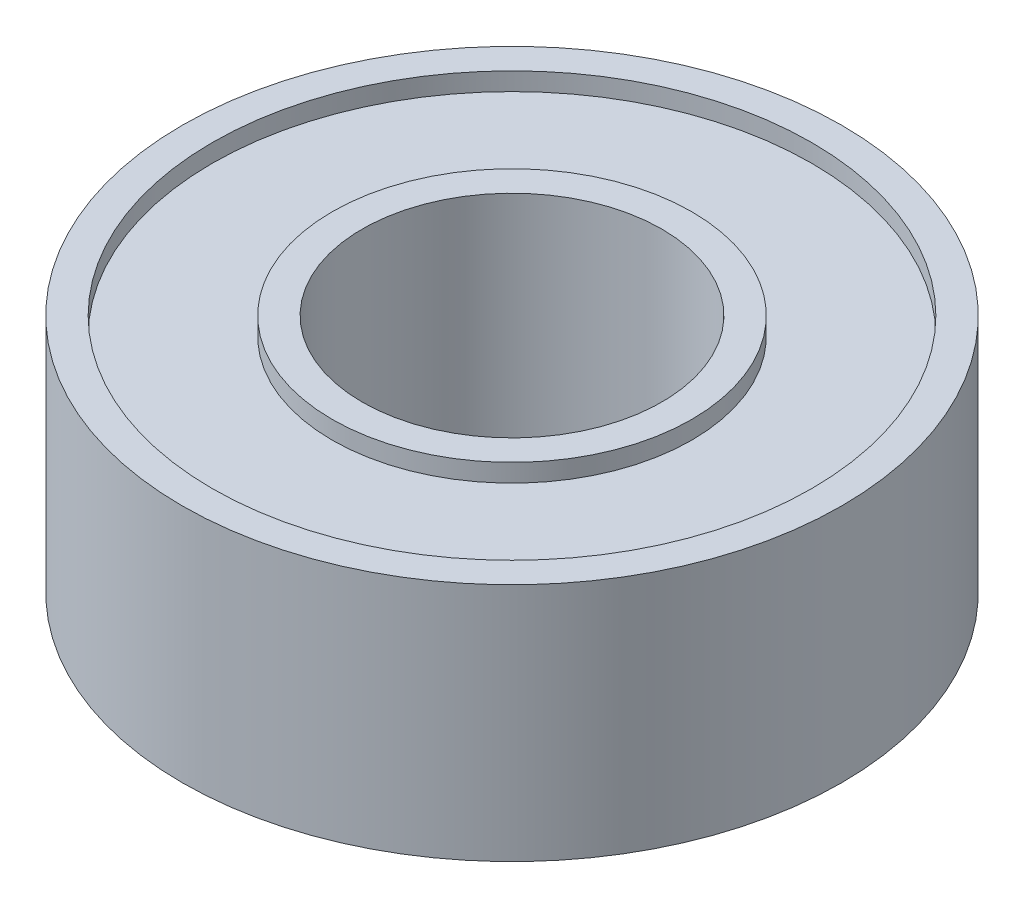
ISO-10303-21;
HEADER;
FILE_DESCRIPTION(('STEP AP214'),'2;1');
FILE_NAME('part.step','',(''),(''),'','','');
FILE_SCHEMA(('AUTOMOTIVE_DESIGN { 1 0 10303 214 1 1 1 1 }'));
ENDSEC;
DATA;
#1=APPLICATION_CONTEXT('core data for automotive mechanical design processes');
#2=APPLICATION_PROTOCOL_DEFINITION('international standard','automotive_design',2000,#1);
#3=PRODUCT_CONTEXT('',#1,'mechanical');
#4=PRODUCT('Part','Part','',(#3));
#5=PRODUCT_RELATED_PRODUCT_CATEGORY('part','',(#4));
#6=PRODUCT_DEFINITION_FORMATION('','',#4);
#7=PRODUCT_DEFINITION_CONTEXT('part definition',#1,'design');
#8=PRODUCT_DEFINITION('design','',#6,#7);
#9=PRODUCT_DEFINITION_SHAPE('','',#8);
#10=(LENGTH_UNIT() NAMED_UNIT(*) SI_UNIT(.MILLI.,.METRE.));
#11=(NAMED_UNIT(*) PLANE_ANGLE_UNIT() SI_UNIT($,.RADIAN.));
#12=(NAMED_UNIT(*) SI_UNIT($,.STERADIAN.) SOLID_ANGLE_UNIT());
#13=UNCERTAINTY_MEASURE_WITH_UNIT(LENGTH_MEASURE(1.E-05),#10,'distance_accuracy_value','');
#14=(GEOMETRIC_REPRESENTATION_CONTEXT(3) GLOBAL_UNCERTAINTY_ASSIGNED_CONTEXT((#13)) GLOBAL_UNIT_ASSIGNED_CONTEXT((#10,
#11,#12)) REPRESENTATION_CONTEXT('',''));
#15=CARTESIAN_POINT('',(0.,0.,0.));
#16=DIRECTION('',(0.,0.,1.));
#17=DIRECTION('',(1.,0.,0.));
#18=AXIS2_PLACEMENT_3D('',#15,#16,#17);
#19=CARTESIAN_POINT('',(0.,0.,0.));
#20=DIRECTION('',(0.,1.,0.));
#21=DIRECTION('',(0.,0.,1.));
#22=AXIS2_PLACEMENT_3D('',#19,#20,#21);
#23=PLANE('',#22);
#24=CARTESIAN_POINT('',(0.,0.,0.));
#25=DIRECTION('',(0.,1.,0.));
#26=DIRECTION('',(0.,0.,1.));
#27=AXIS2_PLACEMENT_3D('',#24,#25,#26);
#28=CIRCLE('',#27,2.5);
#29=CARTESIAN_POINT('',(0.,0.,2.5));
#30=VERTEX_POINT('',#29);
#31=EDGE_CURVE('E44',#30,#30,#28,.T.);
#32=ORIENTED_EDGE('',*,*,#31,.T.);
#33=EDGE_LOOP('',(#32));
#34=FACE_BOUND('',#33,.T.);
#35=CARTESIAN_POINT('',(0.,0.,0.));
#36=DIRECTION('',(0.,-1.,0.));
#37=DIRECTION('',(0.,0.,-1.));
#38=AXIS2_PLACEMENT_3D('',#35,#36,#37);
#39=CIRCLE('',#38,3.);
#40=CARTESIAN_POINT('',(0.,0.,-3.));
#41=VERTEX_POINT('',#40);
#42=EDGE_CURVE('E68',#41,#41,#39,.T.);
#43=ORIENTED_EDGE('',*,*,#42,.T.);
#44=EDGE_LOOP('',(#43));
#45=FACE_BOUND('',#44,.T.);
#46=ADVANCED_FACE('F31',(#34,#45),#23,.F.);
#47=CARTESIAN_POINT('',(0.,4.,0.));
#48=DIRECTION('',(0.,1.,0.));
#49=DIRECTION('',(0.,0.,1.));
#50=AXIS2_PLACEMENT_3D('',#47,#48,#49);
#51=PLANE('',#50);
#52=CARTESIAN_POINT('',(0.,4.,0.));
#53=DIRECTION('',(0.,1.,0.));
#54=DIRECTION('',(0.,0.,1.));
#55=AXIS2_PLACEMENT_3D('',#52,#53,#54);
#56=CIRCLE('',#55,2.5);
#57=CARTESIAN_POINT('',(0.,4.,2.5));
#58=VERTEX_POINT('',#57);
#59=EDGE_CURVE('E42',#58,#58,#56,.T.);
#60=ORIENTED_EDGE('',*,*,#59,.F.);
#61=EDGE_LOOP('',(#60));
#62=FACE_BOUND('',#61,.T.);
#63=CARTESIAN_POINT('',(0.,4.,0.));
#64=DIRECTION('',(0.,1.,0.));
#65=DIRECTION('',(0.,0.,1.));
#66=AXIS2_PLACEMENT_3D('',#63,#64,#65);
#67=CIRCLE('',#66,3.);
#68=CARTESIAN_POINT('',(0.,4.,3.));
#69=VERTEX_POINT('',#68);
#70=EDGE_CURVE('E56',#69,#69,#67,.T.);
#71=ORIENTED_EDGE('',*,*,#70,.T.);
#72=EDGE_LOOP('',(#71));
#73=FACE_BOUND('',#72,.T.);
#74=ADVANCED_FACE('F106',(#62,#73),#51,.T.);
#75=CARTESIAN_POINT('',(0.,4.,0.));
#76=DIRECTION('',(0.,1.,0.));
#77=DIRECTION('',(0.,0.,1.));
#78=AXIS2_PLACEMENT_3D('',#75,#76,#77);
#79=CIRCLE('',#78,5.);
#80=CARTESIAN_POINT('',(0.,4.,5.));
#81=VERTEX_POINT('',#80);
#82=EDGE_CURVE('E50',#81,#81,#79,.T.);
#83=ORIENTED_EDGE('',*,*,#82,.F.);
#84=EDGE_LOOP('',(#83));
#85=FACE_BOUND('',#84,.T.);
#86=CARTESIAN_POINT('',(0.,4.,0.));
#87=DIRECTION('',(0.,1.,0.));
#88=DIRECTION('',(0.,0.,1.));
#89=AXIS2_PLACEMENT_3D('',#86,#87,#88);
#90=CIRCLE('',#89,5.5);
#91=CARTESIAN_POINT('',(0.,4.,5.5));
#92=VERTEX_POINT('',#91);
#93=EDGE_CURVE('E10',#92,#92,#90,.T.);
#94=ORIENTED_EDGE('',*,*,#93,.T.);
#95=EDGE_LOOP('',(#94));
#96=FACE_BOUND('',#95,.T.);
#97=ADVANCED_FACE('F93',(#85,#96),#51,.T.);
#98=CARTESIAN_POINT('',(0.,0.,0.));
#99=DIRECTION('',(0.,-1.,0.));
#100=DIRECTION('',(0.,0.,-1.));
#101=AXIS2_PLACEMENT_3D('',#98,#99,#100);
#102=CIRCLE('',#101,5.);
#103=CARTESIAN_POINT('',(0.,0.,-5.));
#104=VERTEX_POINT('',#103);
#105=EDGE_CURVE('E62',#104,#104,#102,.T.);
#106=ORIENTED_EDGE('',*,*,#105,.F.);
#107=EDGE_LOOP('',(#106));
#108=FACE_BOUND('',#107,.T.);
#109=CARTESIAN_POINT('',(0.,0.,0.));
#110=DIRECTION('',(0.,1.,0.));
#111=DIRECTION('',(0.,0.,1.));
#112=AXIS2_PLACEMENT_3D('',#109,#110,#111);
#113=CIRCLE('',#112,5.5);
#114=CARTESIAN_POINT('',(0.,0.,5.5));
#115=VERTEX_POINT('',#114);
#116=EDGE_CURVE('E35',#115,#115,#113,.T.);
#117=ORIENTED_EDGE('',*,*,#116,.F.);
#118=EDGE_LOOP('',(#117));
#119=FACE_BOUND('',#118,.T.);
#120=ADVANCED_FACE('F90',(#108,#119),#23,.F.);
#121=CARTESIAN_POINT('',(0.,4.,0.));
#122=DIRECTION('',(0.,-1.,0.));
#123=DIRECTION('',(0.,0.,-1.));
#124=AXIS2_PLACEMENT_3D('',#121,#122,#123);
#125=CYLINDRICAL_SURFACE('',#124,5.5);
#126=ORIENTED_EDGE('',*,*,#93,.F.);
#127=EDGE_LOOP('',(#126));
#128=FACE_BOUND('',#127,.T.);
#129=ORIENTED_EDGE('',*,*,#116,.T.);
#130=EDGE_LOOP('',(#129));
#131=FACE_BOUND('',#130,.T.);
#132=ADVANCED_FACE('F33',(#128,#131),#125,.T.);
#133=CARTESIAN_POINT('',(0.,4.,0.));
#134=DIRECTION('',(0.,-1.,0.));
#135=DIRECTION('',(0.,0.,-1.));
#136=AXIS2_PLACEMENT_3D('',#133,#134,#135);
#137=CYLINDRICAL_SURFACE('',#136,2.5);
#138=ORIENTED_EDGE('',*,*,#59,.T.);
#139=EDGE_LOOP('',(#138));
#140=FACE_BOUND('',#139,.T.);
#141=ORIENTED_EDGE('',*,*,#31,.F.);
#142=EDGE_LOOP('',(#141));
#143=FACE_BOUND('',#142,.T.);
#144=ADVANCED_FACE('F97',(#140,#143),#137,.F.);
#145=CARTESIAN_POINT('',(0.,3.7,0.));
#146=DIRECTION('',(0.,1.,0.));
#147=DIRECTION('',(0.,0.,1.));
#148=AXIS2_PLACEMENT_3D('',#145,#146,#147);
#149=CYLINDRICAL_SURFACE('',#148,5.);
#150=CARTESIAN_POINT('',(0.,3.7,0.));
#151=DIRECTION('',(0.,1.,0.));
#152=DIRECTION('',(0.,0.,1.));
#153=AXIS2_PLACEMENT_3D('',#150,#151,#152);
#154=CIRCLE('',#153,5.);
#155=CARTESIAN_POINT('',(0.,3.7,5.));
#156=VERTEX_POINT('',#155);
#157=EDGE_CURVE('E47',#156,#156,#154,.T.);
#158=ORIENTED_EDGE('',*,*,#157,.F.);
#159=EDGE_LOOP('',(#158));
#160=FACE_BOUND('',#159,.T.);
#161=ORIENTED_EDGE('',*,*,#82,.T.);
#162=EDGE_LOOP('',(#161));
#163=FACE_BOUND('',#162,.T.);
#164=ADVANCED_FACE('F102',(#160,#163),#149,.F.);
#165=CARTESIAN_POINT('',(0.,3.7,0.));
#166=DIRECTION('',(0.,1.,0.));
#167=DIRECTION('',(0.,0.,1.));
#168=AXIS2_PLACEMENT_3D('',#165,#166,#167);
#169=PLANE('',#168);
#170=CARTESIAN_POINT('',(0.,3.7,0.));
#171=DIRECTION('',(0.,1.,0.));
#172=DIRECTION('',(0.,0.,1.));
#173=AXIS2_PLACEMENT_3D('',#170,#171,#172);
#174=CIRCLE('',#173,3.);
#175=CARTESIAN_POINT('',(0.,3.7,3.));
#176=VERTEX_POINT('',#175);
#177=EDGE_CURVE('E53',#176,#176,#174,.T.);
#178=ORIENTED_EDGE('',*,*,#177,.F.);
#179=EDGE_LOOP('',(#178));
#180=FACE_BOUND('',#179,.T.);
#181=ORIENTED_EDGE('',*,*,#157,.T.);
#182=EDGE_LOOP('',(#181));
#183=FACE_BOUND('',#182,.T.);
#184=ADVANCED_FACE('F119',(#180,#183),#169,.T.);
#185=CARTESIAN_POINT('',(0.,3.7,0.));
#186=DIRECTION('',(0.,1.,0.));
#187=DIRECTION('',(0.,0.,1.));
#188=AXIS2_PLACEMENT_3D('',#185,#186,#187);
#189=CYLINDRICAL_SURFACE('',#188,3.);
#190=ORIENTED_EDGE('',*,*,#177,.T.);
#191=EDGE_LOOP('',(#190));
#192=FACE_BOUND('',#191,.T.);
#193=ORIENTED_EDGE('',*,*,#70,.F.);
#194=EDGE_LOOP('',(#193));
#195=FACE_BOUND('',#194,.T.);
#196=ADVANCED_FACE('F86',(#192,#195),#189,.T.);
#197=CARTESIAN_POINT('',(0.,0.3,0.));
#198=DIRECTION('',(0.,-1.,0.));
#199=DIRECTION('',(0.,0.,-1.));
#200=AXIS2_PLACEMENT_3D('',#197,#198,#199);
#201=CYLINDRICAL_SURFACE('',#200,5.);
#202=CARTESIAN_POINT('',(0.,0.3,0.));
#203=DIRECTION('',(0.,-1.,0.));
#204=DIRECTION('',(0.,0.,-1.));
#205=AXIS2_PLACEMENT_3D('',#202,#203,#204);
#206=CIRCLE('',#205,5.);
#207=CARTESIAN_POINT('',(0.,0.3,-5.));
#208=VERTEX_POINT('',#207);
#209=EDGE_CURVE('E59',#208,#208,#206,.T.);
#210=ORIENTED_EDGE('',*,*,#209,.F.);
#211=EDGE_LOOP('',(#210));
#212=FACE_BOUND('',#211,.T.);
#213=ORIENTED_EDGE('',*,*,#105,.T.);
#214=EDGE_LOOP('',(#213));
#215=FACE_BOUND('',#214,.T.);
#216=ADVANCED_FACE('F80',(#212,#215),#201,.F.);
#217=CARTESIAN_POINT('',(0.,0.3,0.));
#218=DIRECTION('',(0.,-1.,0.));
#219=DIRECTION('',(0.,0.,-1.));
#220=AXIS2_PLACEMENT_3D('',#217,#218,#219);
#221=PLANE('',#220);
#222=CARTESIAN_POINT('',(0.,0.3,0.));
#223=DIRECTION('',(0.,-1.,0.));
#224=DIRECTION('',(0.,0.,-1.));
#225=AXIS2_PLACEMENT_3D('',#222,#223,#224);
#226=CIRCLE('',#225,3.);
#227=CARTESIAN_POINT('',(0.,0.3,-3.));
#228=VERTEX_POINT('',#227);
#229=EDGE_CURVE('E65',#228,#228,#226,.T.);
#230=ORIENTED_EDGE('',*,*,#229,.F.);
#231=EDGE_LOOP('',(#230));
#232=FACE_BOUND('',#231,.T.);
#233=ORIENTED_EDGE('',*,*,#209,.T.);
#234=EDGE_LOOP('',(#233));
#235=FACE_BOUND('',#234,.T.);
#236=ADVANCED_FACE('F77',(#232,#235),#221,.T.);
#237=CARTESIAN_POINT('',(0.,0.3,0.));
#238=DIRECTION('',(0.,-1.,0.));
#239=DIRECTION('',(0.,0.,-1.));
#240=AXIS2_PLACEMENT_3D('',#237,#238,#239);
#241=CYLINDRICAL_SURFACE('',#240,3.);
#242=ORIENTED_EDGE('',*,*,#229,.T.);
#243=EDGE_LOOP('',(#242));
#244=FACE_BOUND('',#243,.T.);
#245=ORIENTED_EDGE('',*,*,#42,.F.);
#246=EDGE_LOOP('',(#245));
#247=FACE_BOUND('',#246,.T.);
#248=ADVANCED_FACE('F74',(#244,#247),#241,.T.);
#249=CLOSED_SHELL('',(#46,#74,#97,#120,#132,#144,#164,#184,#196,#216,#236,#248));
#250=MANIFOLD_SOLID_BREP('B2',#249);
#251=ADVANCED_BREP_SHAPE_REPRESENTATION('',(#18,#250),#14);
#252=SHAPE_DEFINITION_REPRESENTATION(#9,#251);
ENDSEC;
END-ISO-10303-21;
